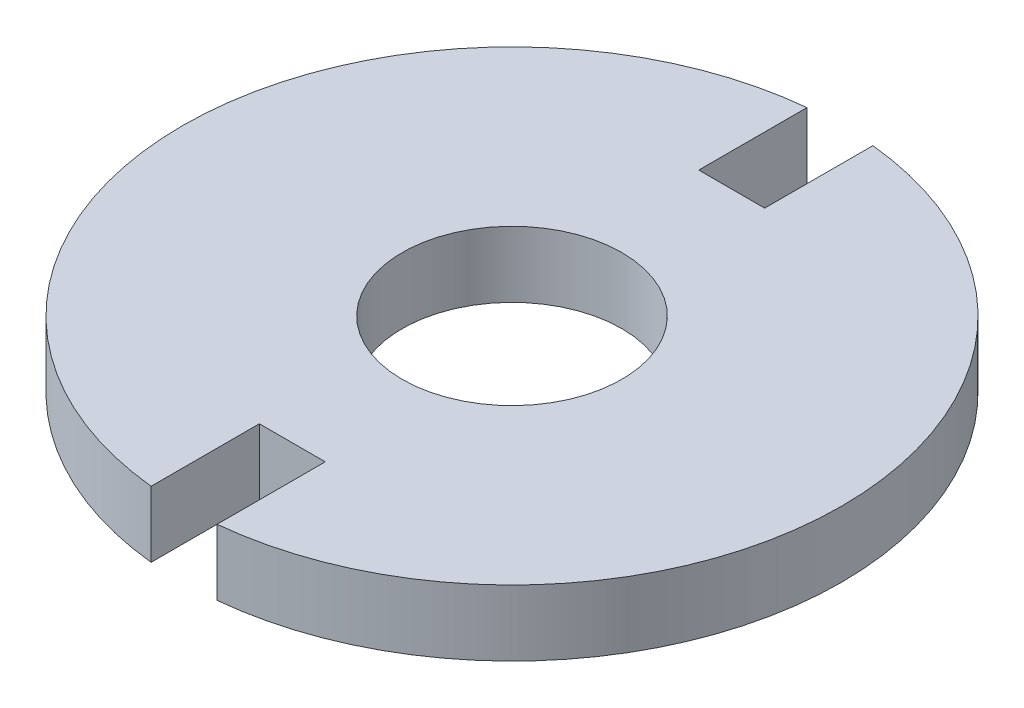
ISO-10303-21;
HEADER;
FILE_DESCRIPTION(('STEP AP214'),'2;1');
FILE_NAME('part.step','',(''),(''),'','','');
FILE_SCHEMA(('AUTOMOTIVE_DESIGN { 1 0 10303 214 1 1 1 1 }'));
ENDSEC;
DATA;
#1=APPLICATION_CONTEXT('core data for automotive mechanical design processes');
#2=APPLICATION_PROTOCOL_DEFINITION('international standard','automotive_design',2000,#1);
#3=PRODUCT_CONTEXT('',#1,'mechanical');
#4=PRODUCT('Part','Part','',(#3));
#5=PRODUCT_RELATED_PRODUCT_CATEGORY('part','',(#4));
#6=PRODUCT_DEFINITION_FORMATION('','',#4);
#7=PRODUCT_DEFINITION_CONTEXT('part definition',#1,'design');
#8=PRODUCT_DEFINITION('design','',#6,#7);
#9=PRODUCT_DEFINITION_SHAPE('','',#8);
#10=(LENGTH_UNIT() NAMED_UNIT(*) SI_UNIT(.MILLI.,.METRE.));
#11=(NAMED_UNIT(*) PLANE_ANGLE_UNIT() SI_UNIT($,.RADIAN.));
#12=(NAMED_UNIT(*) SI_UNIT($,.STERADIAN.) SOLID_ANGLE_UNIT());
#13=UNCERTAINTY_MEASURE_WITH_UNIT(LENGTH_MEASURE(1.E-05),#10,'distance_accuracy_value','');
#14=(GEOMETRIC_REPRESENTATION_CONTEXT(3) GLOBAL_UNCERTAINTY_ASSIGNED_CONTEXT((#13)) GLOBAL_UNIT_ASSIGNED_CONTEXT((#10,
#11,#12)) REPRESENTATION_CONTEXT('',''));
#15=CARTESIAN_POINT('',(0.,0.,0.));
#16=DIRECTION('',(0.,0.,1.));
#17=DIRECTION('',(1.,0.,0.));
#18=AXIS2_PLACEMENT_3D('',#15,#16,#17);
#19=CARTESIAN_POINT('',(0.,3.,0.));
#20=DIRECTION('',(0.,1.,0.));
#21=DIRECTION('',(0.,0.,1.));
#22=AXIS2_PLACEMENT_3D('',#19,#20,#21);
#23=PLANE('',#22);
#24=CARTESIAN_POINT('',(0.,3.,0.));
#25=DIRECTION('',(0.,1.,0.));
#26=DIRECTION('',(0.,0.,1.));
#27=AXIS2_PLACEMENT_3D('',#24,#25,#26);
#28=CIRCLE('',#27,15.);
#29=CARTESIAN_POINT('',(1.5,3.,14.9248115565993));
#30=VERTEX_POINT('',#29);
#31=CARTESIAN_POINT('',(1.5,3.,-14.9248115565993));
#32=VERTEX_POINT('',#31);
#33=EDGE_CURVE('E147',#30,#32,#28,.T.);
#34=ORIENTED_EDGE('',*,*,#33,.T.);
#35=DIRECTION('',(0.,0.,1.));
#36=VECTOR('',#35,1.);
#37=CARTESIAN_POINT('',(1.5,3.,-10.));
#38=LINE('',#37,#36);
#39=CARTESIAN_POINT('',(1.5,3.,-10.));
#40=VERTEX_POINT('',#39);
#41=EDGE_CURVE('E95',#32,#40,#38,.T.);
#42=ORIENTED_EDGE('',*,*,#41,.T.);
#43=DIRECTION('',(-1.,0.,0.));
#44=VECTOR('',#43,1.);
#45=CARTESIAN_POINT('',(-1.5,3.,-10.));
#46=LINE('',#45,#44);
#47=CARTESIAN_POINT('',(-1.5,3.,-10.));
#48=VERTEX_POINT('',#47);
#49=EDGE_CURVE('E162',#40,#48,#46,.T.);
#50=ORIENTED_EDGE('',*,*,#49,.T.);
#51=DIRECTION('',(0.,0.,-1.));
#52=VECTOR('',#51,1.);
#53=CARTESIAN_POINT('',(-1.5,3.,-10.));
#54=LINE('',#53,#52);
#55=CARTESIAN_POINT('',(-1.5,3.,-14.9248115565993));
#56=VERTEX_POINT('',#55);
#57=EDGE_CURVE('E175',#48,#56,#54,.T.);
#58=ORIENTED_EDGE('',*,*,#57,.T.);
#59=CARTESIAN_POINT('',(0.,3.,0.));
#60=DIRECTION('',(0.,1.,0.));
#61=DIRECTION('',(0.,0.,1.));
#62=AXIS2_PLACEMENT_3D('',#59,#60,#61);
#63=CIRCLE('',#62,15.);
#64=CARTESIAN_POINT('',(-1.5,3.,14.9248115565993));
#65=VERTEX_POINT('',#64);
#66=EDGE_CURVE('E114',#56,#65,#63,.T.);
#67=ORIENTED_EDGE('',*,*,#66,.T.);
#68=DIRECTION('',(0.,0.,-1.));
#69=VECTOR('',#68,1.);
#70=CARTESIAN_POINT('',(-1.5,3.,14.9248115565993));
#71=LINE('',#70,#69);
#72=CARTESIAN_POINT('',(-1.5,3.,10.));
#73=VERTEX_POINT('',#72);
#74=EDGE_CURVE('E108',#65,#73,#71,.T.);
#75=ORIENTED_EDGE('',*,*,#74,.T.);
#76=DIRECTION('',(1.,0.,0.));
#77=VECTOR('',#76,1.);
#78=CARTESIAN_POINT('',(-1.5,3.,10.));
#79=LINE('',#78,#77);
#80=CARTESIAN_POINT('',(1.5,3.,10.));
#81=VERTEX_POINT('',#80);
#82=EDGE_CURVE('E112',#73,#81,#79,.T.);
#83=ORIENTED_EDGE('',*,*,#82,.T.);
#84=DIRECTION('',(0.,0.,1.));
#85=VECTOR('',#84,1.);
#86=CARTESIAN_POINT('',(1.5,3.,14.9248115565993));
#87=LINE('',#86,#85);
#88=EDGE_CURVE('E52',#81,#30,#87,.T.);
#89=ORIENTED_EDGE('',*,*,#88,.T.);
#90=EDGE_LOOP('',(#34,#42,#50,#58,#67,#75,#83,#89));
#91=FACE_BOUND('',#90,.T.);
#92=CARTESIAN_POINT('',(0.,3.,0.));
#93=DIRECTION('',(0.,1.,0.));
#94=DIRECTION('',(0.,0.,1.));
#95=AXIS2_PLACEMENT_3D('',#92,#93,#94);
#96=CIRCLE('',#95,5.);
#97=CARTESIAN_POINT('',(0.,3.,5.));
#98=VERTEX_POINT('',#97);
#99=EDGE_CURVE('E136',#98,#98,#96,.T.);
#100=ORIENTED_EDGE('',*,*,#99,.F.);
#101=EDGE_LOOP('',(#100));
#102=FACE_BOUND('',#101,.T.);
#103=ADVANCED_FACE('F35',(#91,#102),#23,.T.);
#104=CARTESIAN_POINT('',(0.,0.,0.));
#105=DIRECTION('',(0.,1.,0.));
#106=DIRECTION('',(0.,0.,1.));
#107=AXIS2_PLACEMENT_3D('',#104,#105,#106);
#108=PLANE('',#107);
#109=CARTESIAN_POINT('',(0.,0.,0.));
#110=DIRECTION('',(0.,1.,0.));
#111=DIRECTION('',(0.,0.,1.));
#112=AXIS2_PLACEMENT_3D('',#109,#110,#111);
#113=CIRCLE('',#112,15.);
#114=CARTESIAN_POINT('',(1.5,0.,14.9248115565993));
#115=VERTEX_POINT('',#114);
#116=CARTESIAN_POINT('',(1.5,0.,-14.9248115565993));
#117=VERTEX_POINT('',#116);
#118=EDGE_CURVE('E132',#115,#117,#113,.T.);
#119=ORIENTED_EDGE('',*,*,#118,.F.);
#120=DIRECTION('',(0.,0.,1.));
#121=VECTOR('',#120,1.);
#122=CARTESIAN_POINT('',(1.5,0.,14.9248115565993));
#123=LINE('',#122,#121);
#124=CARTESIAN_POINT('',(1.5,0.,10.));
#125=VERTEX_POINT('',#124);
#126=EDGE_CURVE('E87',#125,#115,#123,.T.);
#127=ORIENTED_EDGE('',*,*,#126,.F.);
#128=DIRECTION('',(1.,0.,0.));
#129=VECTOR('',#128,1.);
#130=CARTESIAN_POINT('',(-1.5,0.,10.));
#131=LINE('',#130,#129);
#132=CARTESIAN_POINT('',(-1.5,0.,10.));
#133=VERTEX_POINT('',#132);
#134=EDGE_CURVE('E81',#133,#125,#131,.T.);
#135=ORIENTED_EDGE('',*,*,#134,.F.);
#136=DIRECTION('',(0.,0.,-1.));
#137=VECTOR('',#136,1.);
#138=CARTESIAN_POINT('',(-1.5,0.,14.9248115565993));
#139=LINE('',#138,#137);
#140=CARTESIAN_POINT('',(-1.5,0.,14.9248115565993));
#141=VERTEX_POINT('',#140);
#142=EDGE_CURVE('E122',#141,#133,#139,.T.);
#143=ORIENTED_EDGE('',*,*,#142,.F.);
#144=CARTESIAN_POINT('',(0.,0.,0.));
#145=DIRECTION('',(0.,1.,0.));
#146=DIRECTION('',(0.,0.,1.));
#147=AXIS2_PLACEMENT_3D('',#144,#145,#146);
#148=CIRCLE('',#147,15.);
#149=CARTESIAN_POINT('',(-1.5,0.,-14.9248115565993));
#150=VERTEX_POINT('',#149);
#151=EDGE_CURVE('E142',#150,#141,#148,.T.);
#152=ORIENTED_EDGE('',*,*,#151,.F.);
#153=DIRECTION('',(0.,0.,-1.));
#154=VECTOR('',#153,1.);
#155=CARTESIAN_POINT('',(-1.5,0.,-10.));
#156=LINE('',#155,#154);
#157=CARTESIAN_POINT('',(-1.5,0.,-10.));
#158=VERTEX_POINT('',#157);
#159=EDGE_CURVE('E140',#158,#150,#156,.T.);
#160=ORIENTED_EDGE('',*,*,#159,.F.);
#161=DIRECTION('',(-1.,0.,0.));
#162=VECTOR('',#161,1.);
#163=CARTESIAN_POINT('',(-1.5,0.,-10.));
#164=LINE('',#163,#162);
#165=CARTESIAN_POINT('',(1.5,0.,-10.));
#166=VERTEX_POINT('',#165);
#167=EDGE_CURVE('E138',#166,#158,#164,.T.);
#168=ORIENTED_EDGE('',*,*,#167,.F.);
#169=DIRECTION('',(0.,0.,1.));
#170=VECTOR('',#169,1.);
#171=CARTESIAN_POINT('',(1.5,0.,-10.));
#172=LINE('',#171,#170);
#173=EDGE_CURVE('E135',#117,#166,#172,.T.);
#174=ORIENTED_EDGE('',*,*,#173,.F.);
#175=EDGE_LOOP('',(#119,#127,#135,#143,#152,#160,#168,#174));
#176=FACE_BOUND('',#175,.T.);
#177=CARTESIAN_POINT('',(0.,0.,0.));
#178=DIRECTION('',(0.,1.,0.));
#179=DIRECTION('',(0.,0.,1.));
#180=AXIS2_PLACEMENT_3D('',#177,#178,#179);
#181=CIRCLE('',#180,5.);
#182=CARTESIAN_POINT('',(0.,0.,5.));
#183=VERTEX_POINT('',#182);
#184=EDGE_CURVE('E181',#183,#183,#181,.T.);
#185=ORIENTED_EDGE('',*,*,#184,.T.);
#186=EDGE_LOOP('',(#185));
#187=FACE_BOUND('',#186,.T.);
#188=ADVANCED_FACE('F166',(#176,#187),#108,.F.);
#189=CARTESIAN_POINT('',(0.,3.,0.));
#190=DIRECTION('',(0.,-1.,0.));
#191=DIRECTION('',(0.,0.,-1.));
#192=AXIS2_PLACEMENT_3D('',#189,#190,#191);
#193=CYLINDRICAL_SURFACE('',#192,15.);
#194=ORIENTED_EDGE('',*,*,#118,.T.);
#195=DIRECTION('',(0.,-1.,0.));
#196=VECTOR('',#195,1.);
#197=CARTESIAN_POINT('',(1.5,3.,-14.9248115565993));
#198=LINE('',#197,#196);
#199=EDGE_CURVE('E11',#32,#117,#198,.T.);
#200=ORIENTED_EDGE('',*,*,#199,.F.);
#201=ORIENTED_EDGE('',*,*,#33,.F.);
#202=DIRECTION('',(0.,-1.,0.));
#203=VECTOR('',#202,1.);
#204=CARTESIAN_POINT('',(1.5,3.,14.9248115565993));
#205=LINE('',#204,#203);
#206=EDGE_CURVE('E128',#30,#115,#205,.T.);
#207=ORIENTED_EDGE('',*,*,#206,.T.);
#208=EDGE_LOOP('',(#194,#200,#201,#207));
#209=FACE_BOUND('',#208,.T.);
#210=ADVANCED_FACE('F37',(#209),#193,.T.);
#211=CARTESIAN_POINT('',(1.5,3.,-10.));
#212=DIRECTION('',(1.,0.,0.));
#213=DIRECTION('',(0.,0.,-1.));
#214=AXIS2_PLACEMENT_3D('',#211,#212,#213);
#215=PLANE('',#214);
#216=ORIENTED_EDGE('',*,*,#173,.T.);
#217=DIRECTION('',(0.,-1.,0.));
#218=VECTOR('',#217,1.);
#219=CARTESIAN_POINT('',(1.5,3.,-10.));
#220=LINE('',#219,#218);
#221=EDGE_CURVE('E44',#40,#166,#220,.T.);
#222=ORIENTED_EDGE('',*,*,#221,.F.);
#223=ORIENTED_EDGE('',*,*,#41,.F.);
#224=ORIENTED_EDGE('',*,*,#199,.T.);
#225=EDGE_LOOP('',(#216,#222,#223,#224));
#226=FACE_BOUND('',#225,.T.);
#227=ADVANCED_FACE('F209',(#226),#215,.F.);
#228=CARTESIAN_POINT('',(-1.5,3.,-10.));
#229=DIRECTION('',(0.,0.,1.));
#230=DIRECTION('',(1.,0.,0.));
#231=AXIS2_PLACEMENT_3D('',#228,#229,#230);
#232=PLANE('',#231);
#233=ORIENTED_EDGE('',*,*,#167,.T.);
#234=DIRECTION('',(0.,-1.,0.));
#235=VECTOR('',#234,1.);
#236=CARTESIAN_POINT('',(-1.5,3.,-10.));
#237=LINE('',#236,#235);
#238=EDGE_CURVE('E154',#48,#158,#237,.T.);
#239=ORIENTED_EDGE('',*,*,#238,.F.);
#240=ORIENTED_EDGE('',*,*,#49,.F.);
#241=ORIENTED_EDGE('',*,*,#221,.T.);
#242=EDGE_LOOP('',(#233,#239,#240,#241));
#243=FACE_BOUND('',#242,.T.);
#244=ADVANCED_FACE('F160',(#243),#232,.F.);
#245=CARTESIAN_POINT('',(-1.5,3.,-10.));
#246=DIRECTION('',(-1.,0.,0.));
#247=DIRECTION('',(0.,0.,1.));
#248=AXIS2_PLACEMENT_3D('',#245,#246,#247);
#249=PLANE('',#248);
#250=ORIENTED_EDGE('',*,*,#159,.T.);
#251=DIRECTION('',(0.,-1.,0.));
#252=VECTOR('',#251,1.);
#253=CARTESIAN_POINT('',(-1.5,3.,-14.9248115565993));
#254=LINE('',#253,#252);
#255=EDGE_CURVE('E151',#56,#150,#254,.T.);
#256=ORIENTED_EDGE('',*,*,#255,.F.);
#257=ORIENTED_EDGE('',*,*,#57,.F.);
#258=ORIENTED_EDGE('',*,*,#238,.T.);
#259=EDGE_LOOP('',(#250,#256,#257,#258));
#260=FACE_BOUND('',#259,.T.);
#261=ADVANCED_FACE('F171',(#260),#249,.F.);
#262=CARTESIAN_POINT('',(0.,3.,0.));
#263=DIRECTION('',(0.,-1.,0.));
#264=DIRECTION('',(0.,0.,-1.));
#265=AXIS2_PLACEMENT_3D('',#262,#263,#264);
#266=CYLINDRICAL_SURFACE('',#265,15.);
#267=ORIENTED_EDGE('',*,*,#151,.T.);
#268=DIRECTION('',(0.,-1.,0.));
#269=VECTOR('',#268,1.);
#270=CARTESIAN_POINT('',(-1.5,3.,14.9248115565993));
#271=LINE('',#270,#269);
#272=EDGE_CURVE('E123',#65,#141,#271,.T.);
#273=ORIENTED_EDGE('',*,*,#272,.F.);
#274=ORIENTED_EDGE('',*,*,#66,.F.);
#275=ORIENTED_EDGE('',*,*,#255,.T.);
#276=EDGE_LOOP('',(#267,#273,#274,#275));
#277=FACE_BOUND('',#276,.T.);
#278=ADVANCED_FACE('F174',(#277),#266,.T.);
#279=CARTESIAN_POINT('',(-1.5,3.,14.9248115565993));
#280=DIRECTION('',(-1.,0.,0.));
#281=DIRECTION('',(0.,0.,1.));
#282=AXIS2_PLACEMENT_3D('',#279,#280,#281);
#283=PLANE('',#282);
#284=ORIENTED_EDGE('',*,*,#142,.T.);
#285=DIRECTION('',(0.,-1.,0.));
#286=VECTOR('',#285,1.);
#287=CARTESIAN_POINT('',(-1.5,3.,10.));
#288=LINE('',#287,#286);
#289=EDGE_CURVE('E119',#73,#133,#288,.T.);
#290=ORIENTED_EDGE('',*,*,#289,.F.);
#291=ORIENTED_EDGE('',*,*,#74,.F.);
#292=ORIENTED_EDGE('',*,*,#272,.T.);
#293=EDGE_LOOP('',(#284,#290,#291,#292));
#294=FACE_BOUND('',#293,.T.);
#295=ADVANCED_FACE('F120',(#294),#283,.F.);
#296=CARTESIAN_POINT('',(-1.5,3.,10.));
#297=DIRECTION('',(0.,0.,-1.));
#298=DIRECTION('',(-1.,0.,0.));
#299=AXIS2_PLACEMENT_3D('',#296,#297,#298);
#300=PLANE('',#299);
#301=ORIENTED_EDGE('',*,*,#134,.T.);
#302=DIRECTION('',(0.,-1.,0.));
#303=VECTOR('',#302,1.);
#304=CARTESIAN_POINT('',(1.5,3.,10.));
#305=LINE('',#304,#303);
#306=EDGE_CURVE('E124',#81,#125,#305,.T.);
#307=ORIENTED_EDGE('',*,*,#306,.F.);
#308=ORIENTED_EDGE('',*,*,#82,.F.);
#309=ORIENTED_EDGE('',*,*,#289,.T.);
#310=EDGE_LOOP('',(#301,#307,#308,#309));
#311=FACE_BOUND('',#310,.T.);
#312=ADVANCED_FACE('F126',(#311),#300,.F.);
#313=CARTESIAN_POINT('',(1.5,3.,14.9248115565993));
#314=DIRECTION('',(1.,0.,0.));
#315=DIRECTION('',(0.,0.,-1.));
#316=AXIS2_PLACEMENT_3D('',#313,#314,#315);
#317=PLANE('',#316);
#318=ORIENTED_EDGE('',*,*,#126,.T.);
#319=ORIENTED_EDGE('',*,*,#206,.F.);
#320=ORIENTED_EDGE('',*,*,#88,.F.);
#321=ORIENTED_EDGE('',*,*,#306,.T.);
#322=EDGE_LOOP('',(#318,#319,#320,#321));
#323=FACE_BOUND('',#322,.T.);
#324=ADVANCED_FACE('F197',(#323),#317,.F.);
#325=CARTESIAN_POINT('',(0.,3.,0.));
#326=DIRECTION('',(0.,-1.,0.));
#327=DIRECTION('',(0.,0.,-1.));
#328=AXIS2_PLACEMENT_3D('',#325,#326,#327);
#329=CYLINDRICAL_SURFACE('',#328,5.);
#330=ORIENTED_EDGE('',*,*,#99,.T.);
#331=EDGE_LOOP('',(#330));
#332=FACE_BOUND('',#331,.T.);
#333=ORIENTED_EDGE('',*,*,#184,.F.);
#334=EDGE_LOOP('',(#333));
#335=FACE_BOUND('',#334,.T.);
#336=ADVANCED_FACE('F187',(#332,#335),#329,.F.);
#337=CLOSED_SHELL('',(#103,#188,#210,#227,#244,#261,#278,#295,#312,#324,#336));
#338=MANIFOLD_SOLID_BREP('B2',#337);
#339=ADVANCED_BREP_SHAPE_REPRESENTATION('',(#18,#338),#14);
#340=SHAPE_DEFINITION_REPRESENTATION(#9,#339);
ENDSEC;
END-ISO-10303-21;
